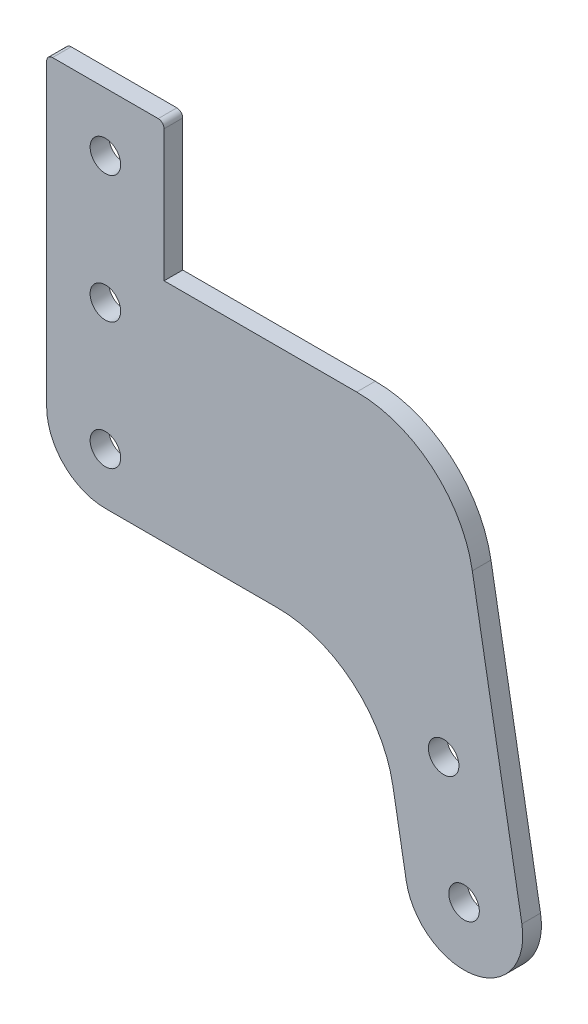
ISO-10303-21;
HEADER;
FILE_DESCRIPTION(('STEP AP214'),'2;1');
FILE_NAME('part.step','',(''),(''),'','','');
FILE_SCHEMA(('AUTOMOTIVE_DESIGN { 1 0 10303 214 1 1 1 1 }'));
ENDSEC;
DATA;
#1=APPLICATION_CONTEXT('core data for automotive mechanical design processes');
#2=APPLICATION_PROTOCOL_DEFINITION('international standard','automotive_design',2000,#1);
#3=PRODUCT_CONTEXT('',#1,'mechanical');
#4=PRODUCT('Part','Part','',(#3));
#5=PRODUCT_RELATED_PRODUCT_CATEGORY('part','',(#4));
#6=PRODUCT_DEFINITION_FORMATION('','',#4);
#7=PRODUCT_DEFINITION_CONTEXT('part definition',#1,'design');
#8=PRODUCT_DEFINITION('design','',#6,#7);
#9=PRODUCT_DEFINITION_SHAPE('','',#8);
#10=(LENGTH_UNIT() NAMED_UNIT(*) SI_UNIT(.MILLI.,.METRE.));
#11=(NAMED_UNIT(*) PLANE_ANGLE_UNIT() SI_UNIT($,.RADIAN.));
#12=(NAMED_UNIT(*) SI_UNIT($,.STERADIAN.) SOLID_ANGLE_UNIT());
#13=UNCERTAINTY_MEASURE_WITH_UNIT(LENGTH_MEASURE(1.E-05),#10,'distance_accuracy_value','');
#14=(GEOMETRIC_REPRESENTATION_CONTEXT(3) GLOBAL_UNCERTAINTY_ASSIGNED_CONTEXT((#13)) GLOBAL_UNIT_ASSIGNED_CONTEXT((#10,
#11,#12)) REPRESENTATION_CONTEXT('',''));
#15=CARTESIAN_POINT('',(0.,0.,0.));
#16=DIRECTION('',(0.,0.,1.));
#17=DIRECTION('',(1.,0.,0.));
#18=AXIS2_PLACEMENT_3D('',#15,#16,#17);
#19=CARTESIAN_POINT('',(71.083923818797,270.455974019315,420.));
#20=DIRECTION('',(0.,0.,1.));
#21=DIRECTION('',(1.,0.,0.));
#22=AXIS2_PLACEMENT_3D('',#19,#20,#21);
#23=CYLINDRICAL_SURFACE('',#22,9.99999999999986);
#24=CARTESIAN_POINT('',(71.083923818797,270.455974019315,423.175));
#25=DIRECTION('',(0.,0.,1.));
#26=DIRECTION('',(1.,0.,0.));
#27=AXIS2_PLACEMENT_3D('',#24,#25,#26);
#28=CIRCLE('',#27,9.99999999999986);
#29=CARTESIAN_POINT('',(61.236098321009,268.71806350231,423.175));
#30=VERTEX_POINT('',#29);
#31=CARTESIAN_POINT('',(72.8208818309538,260.607980474232,423.175));
#32=VERTEX_POINT('',#31);
#33=EDGE_CURVE('E173',#30,#32,#28,.T.);
#34=ORIENTED_EDGE('',*,*,#33,.F.);
#35=DIRECTION('',(0.,0.,1.));
#36=VECTOR('',#35,1.);
#37=CARTESIAN_POINT('',(61.236098321009,268.71806350231,420.));
#38=LINE('',#37,#36);
#39=CARTESIAN_POINT('',(61.236098321009,268.71806350231,420.));
#40=VERTEX_POINT('',#39);
#41=EDGE_CURVE('E11',#40,#30,#38,.T.);
#42=ORIENTED_EDGE('',*,*,#41,.F.);
#43=CARTESIAN_POINT('',(71.083923818797,270.455974019315,420.));
#44=DIRECTION('',(0.,0.,1.));
#45=DIRECTION('',(1.,0.,0.));
#46=AXIS2_PLACEMENT_3D('',#43,#44,#45);
#47=CIRCLE('',#46,9.99999999999986);
#48=CARTESIAN_POINT('',(72.8208818309538,260.607980474232,420.));
#49=VERTEX_POINT('',#48);
#50=EDGE_CURVE('E220',#40,#49,#47,.T.);
#51=ORIENTED_EDGE('',*,*,#50,.T.);
#52=DIRECTION('',(0.,0.,1.));
#53=VECTOR('',#52,1.);
#54=CARTESIAN_POINT('',(72.8208818309538,260.607980474232,420.));
#55=LINE('',#54,#53);
#56=EDGE_CURVE('E37',#49,#32,#55,.T.);
#57=ORIENTED_EDGE('',*,*,#56,.T.);
#58=EDGE_LOOP('',(#34,#42,#51,#57));
#59=FACE_BOUND('',#58,.T.);
#60=ADVANCED_FACE('F34',(#59),#23,.T.);
#61=CARTESIAN_POINT('',(58.9846529645977,281.47582103401,420.));
#62=DIRECTION('',(-0.984782549778797,-0.173791051700518,0.));
#63=DIRECTION('',(0.173791051700518,-0.984782549778797,0.));
#64=AXIS2_PLACEMENT_3D('',#61,#62,#63);
#65=PLANE('',#64);
#66=DIRECTION('',(0.173791051700518,-0.984782549778797,0.));
#67=VECTOR('',#66,1.);
#68=CARTESIAN_POINT('',(58.9846529645977,281.47582103401,423.175));
#69=LINE('',#68,#67);
#70=CARTESIAN_POINT('',(58.9846529645977,281.47582103401,423.175));
#71=VERTEX_POINT('',#70);
#72=EDGE_CURVE('E218',#71,#30,#69,.T.);
#73=ORIENTED_EDGE('',*,*,#72,.F.);
#74=DIRECTION('',(0.,0.,1.));
#75=VECTOR('',#74,1.);
#76=CARTESIAN_POINT('',(58.9846529645977,281.47582103401,420.));
#77=LINE('',#76,#75);
#78=CARTESIAN_POINT('',(58.9846529645977,281.47582103401,420.));
#79=VERTEX_POINT('',#78);
#80=EDGE_CURVE('E43',#79,#71,#77,.T.);
#81=ORIENTED_EDGE('',*,*,#80,.F.);
#82=DIRECTION('',(0.173791051700518,-0.984782549778797,0.));
#83=VECTOR('',#82,1.);
#84=CARTESIAN_POINT('',(58.9846529645977,281.47582103401,420.));
#85=LINE('',#84,#83);
#86=EDGE_CURVE('E163',#79,#40,#85,.T.);
#87=ORIENTED_EDGE('',*,*,#86,.T.);
#88=ORIENTED_EDGE('',*,*,#41,.T.);
#89=EDGE_LOOP('',(#73,#81,#87,#88));
#90=FACE_BOUND('',#89,.T.);
#91=ADVANCED_FACE('F246',(#90),#65,.T.);
#92=CARTESIAN_POINT('',(39.2890019690218,278.,420.));
#93=DIRECTION('',(0.,0.,1.));
#94=DIRECTION('',(1.,0.,0.));
#95=AXIS2_PLACEMENT_3D('',#92,#93,#94);
#96=CYLINDRICAL_SURFACE('',#95,20.);
#97=CARTESIAN_POINT('',(39.2890019690218,278.,423.175));
#98=DIRECTION('',(0.,0.,-1.));
#99=DIRECTION('',(-1.,0.,0.));
#100=AXIS2_PLACEMENT_3D('',#97,#98,#99);
#101=CIRCLE('',#100,20.);
#102=CARTESIAN_POINT('',(39.2890019690218,298.,423.175));
#103=VERTEX_POINT('',#102);
#104=EDGE_CURVE('E150',#103,#71,#101,.T.);
#105=ORIENTED_EDGE('',*,*,#104,.F.);
#106=DIRECTION('',(0.,0.,1.));
#107=VECTOR('',#106,1.);
#108=CARTESIAN_POINT('',(39.2890019690218,298.,420.));
#109=LINE('',#108,#107);
#110=CARTESIAN_POINT('',(39.2890019690218,298.,420.));
#111=VERTEX_POINT('',#110);
#112=EDGE_CURVE('E145',#111,#103,#109,.T.);
#113=ORIENTED_EDGE('',*,*,#112,.F.);
#114=CARTESIAN_POINT('',(39.2890019690218,278.,420.));
#115=DIRECTION('',(0.,0.,-1.));
#116=DIRECTION('',(-1.,0.,0.));
#117=AXIS2_PLACEMENT_3D('',#114,#115,#116);
#118=CIRCLE('',#117,20.);
#119=EDGE_CURVE('E148',#111,#79,#118,.T.);
#120=ORIENTED_EDGE('',*,*,#119,.T.);
#121=ORIENTED_EDGE('',*,*,#80,.T.);
#122=EDGE_LOOP('',(#105,#113,#120,#121));
#123=FACE_BOUND('',#122,.T.);
#124=ADVANCED_FACE('F147',(#123),#96,.F.);
#125=CARTESIAN_POINT('',(10.,298.,420.));
#126=DIRECTION('',(0.,-1.,0.));
#127=DIRECTION('',(1.,0.,0.));
#128=AXIS2_PLACEMENT_3D('',#125,#126,#127);
#129=PLANE('',#128);
#130=DIRECTION('',(1.,0.,0.));
#131=VECTOR('',#130,1.);
#132=CARTESIAN_POINT('',(10.,298.,423.175));
#133=LINE('',#132,#131);
#134=CARTESIAN_POINT('',(10.,298.,423.175));
#135=VERTEX_POINT('',#134);
#136=EDGE_CURVE('E215',#135,#103,#133,.T.);
#137=ORIENTED_EDGE('',*,*,#136,.F.);
#138=DIRECTION('',(0.,0.,1.));
#139=VECTOR('',#138,1.);
#140=CARTESIAN_POINT('',(10.,298.,420.));
#141=LINE('',#140,#139);
#142=CARTESIAN_POINT('',(10.,298.,420.));
#143=VERTEX_POINT('',#142);
#144=EDGE_CURVE('E155',#143,#135,#141,.T.);
#145=ORIENTED_EDGE('',*,*,#144,.F.);
#146=DIRECTION('',(1.,0.,0.));
#147=VECTOR('',#146,1.);
#148=CARTESIAN_POINT('',(10.,298.,420.));
#149=LINE('',#148,#147);
#150=EDGE_CURVE('E161',#143,#111,#149,.T.);
#151=ORIENTED_EDGE('',*,*,#150,.T.);
#152=ORIENTED_EDGE('',*,*,#112,.T.);
#153=EDGE_LOOP('',(#137,#145,#151,#152));
#154=FACE_BOUND('',#153,.T.);
#155=ADVANCED_FACE('F165',(#154),#129,.T.);
#156=CARTESIAN_POINT('',(10.,308.,420.));
#157=DIRECTION('',(0.,0.,1.));
#158=DIRECTION('',(1.,0.,0.));
#159=AXIS2_PLACEMENT_3D('',#156,#157,#158);
#160=CYLINDRICAL_SURFACE('',#159,10.);
#161=CARTESIAN_POINT('',(10.,308.,423.175));
#162=DIRECTION('',(0.,0.,1.));
#163=DIRECTION('',(1.,0.,0.));
#164=AXIS2_PLACEMENT_3D('',#161,#162,#163);
#165=CIRCLE('',#164,10.);
#166=CARTESIAN_POINT('',(0.,308.,423.175));
#167=VERTEX_POINT('',#166);
#168=EDGE_CURVE('E212',#167,#135,#165,.T.);
#169=ORIENTED_EDGE('',*,*,#168,.F.);
#170=DIRECTION('',(0.,0.,1.));
#171=VECTOR('',#170,1.);
#172=CARTESIAN_POINT('',(0.,308.,420.));
#173=LINE('',#172,#171);
#174=CARTESIAN_POINT('',(0.,308.,420.));
#175=VERTEX_POINT('',#174);
#176=EDGE_CURVE('E224',#175,#167,#173,.T.);
#177=ORIENTED_EDGE('',*,*,#176,.F.);
#178=CARTESIAN_POINT('',(10.,308.,420.));
#179=DIRECTION('',(0.,0.,1.));
#180=DIRECTION('',(1.,0.,0.));
#181=AXIS2_PLACEMENT_3D('',#178,#179,#180);
#182=CIRCLE('',#181,10.);
#183=EDGE_CURVE('E166',#175,#143,#182,.T.);
#184=ORIENTED_EDGE('',*,*,#183,.T.);
#185=ORIENTED_EDGE('',*,*,#144,.T.);
#186=EDGE_LOOP('',(#169,#177,#184,#185));
#187=FACE_BOUND('',#186,.T.);
#188=ADVANCED_FACE('F259',(#187),#160,.T.);
#189=CARTESIAN_POINT('',(0.,359.,420.));
#190=DIRECTION('',(-1.,0.,0.));
#191=DIRECTION('',(0.,0.,1.));
#192=AXIS2_PLACEMENT_3D('',#189,#190,#191);
#193=PLANE('',#192);
#194=DIRECTION('',(0.,-1.,0.));
#195=VECTOR('',#194,1.);
#196=CARTESIAN_POINT('',(0.,359.,423.175));
#197=LINE('',#196,#195);
#198=CARTESIAN_POINT('',(0.,359.,423.175));
#199=VERTEX_POINT('',#198);
#200=EDGE_CURVE('E209',#199,#167,#197,.T.);
#201=ORIENTED_EDGE('',*,*,#200,.F.);
#202=DIRECTION('',(0.,0.,1.));
#203=VECTOR('',#202,1.);
#204=CARTESIAN_POINT('',(0.,359.,420.));
#205=LINE('',#204,#203);
#206=CARTESIAN_POINT('',(0.,359.,420.));
#207=VERTEX_POINT('',#206);
#208=EDGE_CURVE('E226',#207,#199,#205,.T.);
#209=ORIENTED_EDGE('',*,*,#208,.F.);
#210=DIRECTION('',(0.,-1.,0.));
#211=VECTOR('',#210,1.);
#212=CARTESIAN_POINT('',(0.,359.,420.));
#213=LINE('',#212,#211);
#214=EDGE_CURVE('E168',#207,#175,#213,.T.);
#215=ORIENTED_EDGE('',*,*,#214,.T.);
#216=ORIENTED_EDGE('',*,*,#176,.T.);
#217=EDGE_LOOP('',(#201,#209,#215,#216));
#218=FACE_BOUND('',#217,.T.);
#219=ADVANCED_FACE('F262',(#218),#193,.T.);
#220=CARTESIAN_POINT('',(1.,359.,420.));
#221=DIRECTION('',(0.,0.,1.));
#222=DIRECTION('',(1.,0.,0.));
#223=AXIS2_PLACEMENT_3D('',#220,#221,#222);
#224=CYLINDRICAL_SURFACE('',#223,1.);
#225=CARTESIAN_POINT('',(1.,359.,423.175));
#226=DIRECTION('',(0.,0.,1.));
#227=DIRECTION('',(1.,0.,0.));
#228=AXIS2_PLACEMENT_3D('',#225,#226,#227);
#229=CIRCLE('',#228,1.);
#230=CARTESIAN_POINT('',(1.,360.,423.175));
#231=VERTEX_POINT('',#230);
#232=EDGE_CURVE('E206',#231,#199,#229,.T.);
#233=ORIENTED_EDGE('',*,*,#232,.F.);
#234=DIRECTION('',(0.,0.,1.));
#235=VECTOR('',#234,1.);
#236=CARTESIAN_POINT('',(1.,360.,420.));
#237=LINE('',#236,#235);
#238=CARTESIAN_POINT('',(1.,360.,420.));
#239=VERTEX_POINT('',#238);
#240=EDGE_CURVE('E228',#239,#231,#237,.T.);
#241=ORIENTED_EDGE('',*,*,#240,.F.);
#242=CARTESIAN_POINT('',(1.,359.,420.));
#243=DIRECTION('',(0.,0.,1.));
#244=DIRECTION('',(1.,0.,0.));
#245=AXIS2_PLACEMENT_3D('',#242,#243,#244);
#246=CIRCLE('',#245,1.);
#247=EDGE_CURVE('E392',#239,#207,#246,.T.);
#248=ORIENTED_EDGE('',*,*,#247,.T.);
#249=ORIENTED_EDGE('',*,*,#208,.T.);
#250=EDGE_LOOP('',(#233,#241,#248,#249));
#251=FACE_BOUND('',#250,.T.);
#252=ADVANCED_FACE('F266',(#251),#224,.T.);
#253=CARTESIAN_POINT('',(19.,360.,420.));
#254=DIRECTION('',(0.,1.,0.));
#255=DIRECTION('',(0.,0.,1.));
#256=AXIS2_PLACEMENT_3D('',#253,#254,#255);
#257=PLANE('',#256);
#258=DIRECTION('',(-1.,0.,0.));
#259=VECTOR('',#258,1.);
#260=CARTESIAN_POINT('',(19.,360.,423.175));
#261=LINE('',#260,#259);
#262=CARTESIAN_POINT('',(19.,360.,423.175));
#263=VERTEX_POINT('',#262);
#264=EDGE_CURVE('E203',#263,#231,#261,.T.);
#265=ORIENTED_EDGE('',*,*,#264,.F.);
#266=DIRECTION('',(0.,0.,1.));
#267=VECTOR('',#266,1.);
#268=CARTESIAN_POINT('',(19.,360.,420.));
#269=LINE('',#268,#267);
#270=CARTESIAN_POINT('',(19.,360.,420.));
#271=VERTEX_POINT('',#270);
#272=EDGE_CURVE('E230',#271,#263,#269,.T.);
#273=ORIENTED_EDGE('',*,*,#272,.F.);
#274=DIRECTION('',(-1.,0.,0.));
#275=VECTOR('',#274,1.);
#276=CARTESIAN_POINT('',(19.,360.,420.));
#277=LINE('',#276,#275);
#278=EDGE_CURVE('E389',#271,#239,#277,.T.);
#279=ORIENTED_EDGE('',*,*,#278,.T.);
#280=ORIENTED_EDGE('',*,*,#240,.T.);
#281=EDGE_LOOP('',(#265,#273,#279,#280));
#282=FACE_BOUND('',#281,.T.);
#283=ADVANCED_FACE('F270',(#282),#257,.T.);
#284=CARTESIAN_POINT('',(19.,359.,420.));
#285=DIRECTION('',(0.,0.,1.));
#286=DIRECTION('',(1.,0.,0.));
#287=AXIS2_PLACEMENT_3D('',#284,#285,#286);
#288=CYLINDRICAL_SURFACE('',#287,0.999999999999999);
#289=CARTESIAN_POINT('',(19.,359.,423.175));
#290=DIRECTION('',(0.,0.,1.));
#291=DIRECTION('',(1.,0.,0.));
#292=AXIS2_PLACEMENT_3D('',#289,#290,#291);
#293=CIRCLE('',#292,0.999999999999999);
#294=CARTESIAN_POINT('',(20.,359.,423.175));
#295=VERTEX_POINT('',#294);
#296=EDGE_CURVE('E200',#295,#263,#293,.T.);
#297=ORIENTED_EDGE('',*,*,#296,.F.);
#298=DIRECTION('',(0.,0.,1.));
#299=VECTOR('',#298,1.);
#300=CARTESIAN_POINT('',(20.,359.,420.));
#301=LINE('',#300,#299);
#302=CARTESIAN_POINT('',(20.,359.,420.));
#303=VERTEX_POINT('',#302);
#304=EDGE_CURVE('E232',#303,#295,#301,.T.);
#305=ORIENTED_EDGE('',*,*,#304,.F.);
#306=CARTESIAN_POINT('',(19.,359.,420.));
#307=DIRECTION('',(0.,0.,1.));
#308=DIRECTION('',(1.,0.,0.));
#309=AXIS2_PLACEMENT_3D('',#306,#307,#308);
#310=CIRCLE('',#309,0.999999999999999);
#311=EDGE_CURVE('E386',#303,#271,#310,.T.);
#312=ORIENTED_EDGE('',*,*,#311,.T.);
#313=ORIENTED_EDGE('',*,*,#272,.T.);
#314=EDGE_LOOP('',(#297,#305,#312,#313));
#315=FACE_BOUND('',#314,.T.);
#316=ADVANCED_FACE('F274',(#315),#288,.T.);
#317=CARTESIAN_POINT('',(20.,336.575000000001,420.));
#318=DIRECTION('',(1.,0.,0.));
#319=DIRECTION('',(0.,1.,0.));
#320=AXIS2_PLACEMENT_3D('',#317,#318,#319);
#321=PLANE('',#320);
#322=DIRECTION('',(0.,1.,0.));
#323=VECTOR('',#322,1.);
#324=CARTESIAN_POINT('',(20.,336.575000000001,423.175));
#325=LINE('',#324,#323);
#326=CARTESIAN_POINT('',(20.,336.575000000001,423.175));
#327=VERTEX_POINT('',#326);
#328=EDGE_CURVE('E197',#327,#295,#325,.T.);
#329=ORIENTED_EDGE('',*,*,#328,.F.);
#330=DIRECTION('',(0.,0.,1.));
#331=VECTOR('',#330,1.);
#332=CARTESIAN_POINT('',(20.,336.575000000001,420.));
#333=LINE('',#332,#331);
#334=CARTESIAN_POINT('',(20.,336.575000000001,420.));
#335=VERTEX_POINT('',#334);
#336=EDGE_CURVE('E234',#335,#327,#333,.T.);
#337=ORIENTED_EDGE('',*,*,#336,.F.);
#338=DIRECTION('',(0.,1.,0.));
#339=VECTOR('',#338,1.);
#340=CARTESIAN_POINT('',(20.,336.575000000001,420.));
#341=LINE('',#340,#339);
#342=EDGE_CURVE('E383',#335,#303,#341,.T.);
#343=ORIENTED_EDGE('',*,*,#342,.T.);
#344=ORIENTED_EDGE('',*,*,#304,.T.);
#345=EDGE_LOOP('',(#329,#337,#343,#344));
#346=FACE_BOUND('',#345,.T.);
#347=ADVANCED_FACE('F278',(#346),#321,.T.);
#348=CARTESIAN_POINT('',(52.7962249915629,336.575000000001,420.));
#349=DIRECTION('',(0.,1.,0.));
#350=DIRECTION('',(0.,0.,1.));
#351=AXIS2_PLACEMENT_3D('',#348,#349,#350);
#352=PLANE('',#351);
#353=DIRECTION('',(-1.,0.,0.));
#354=VECTOR('',#353,1.);
#355=CARTESIAN_POINT('',(52.7962249915629,336.575000000001,423.175));
#356=LINE('',#355,#354);
#357=CARTESIAN_POINT('',(52.7962249915629,336.575000000001,423.175));
#358=VERTEX_POINT('',#357);
#359=EDGE_CURVE('E194',#358,#327,#356,.T.);
#360=ORIENTED_EDGE('',*,*,#359,.F.);
#361=DIRECTION('',(0.,0.,1.));
#362=VECTOR('',#361,1.);
#363=CARTESIAN_POINT('',(52.7962249915629,336.575000000001,420.));
#364=LINE('',#363,#362);
#365=CARTESIAN_POINT('',(52.7962249915629,336.575000000001,420.));
#366=VERTEX_POINT('',#365);
#367=EDGE_CURVE('E236',#366,#358,#364,.T.);
#368=ORIENTED_EDGE('',*,*,#367,.F.);
#369=DIRECTION('',(-1.,0.,0.));
#370=VECTOR('',#369,1.);
#371=CARTESIAN_POINT('',(52.7962249915629,336.575000000001,420.));
#372=LINE('',#371,#370);
#373=EDGE_CURVE('E380',#366,#335,#372,.T.);
#374=ORIENTED_EDGE('',*,*,#373,.T.);
#375=ORIENTED_EDGE('',*,*,#336,.T.);
#376=EDGE_LOOP('',(#360,#368,#374,#375));
#377=FACE_BOUND('',#376,.T.);
#378=ADVANCED_FACE('F282',(#377),#352,.T.);
#379=CARTESIAN_POINT('',(52.7962249915629,316.575000000001,420.));
#380=DIRECTION('',(0.,0.,1.));
#381=DIRECTION('',(1.,0.,0.));
#382=AXIS2_PLACEMENT_3D('',#379,#380,#381);
#383=CYLINDRICAL_SURFACE('',#382,20.);
#384=CARTESIAN_POINT('',(52.7962249915629,316.575000000001,423.175));
#385=DIRECTION('',(0.,0.,1.));
#386=DIRECTION('',(1.,0.,0.));
#387=AXIS2_PLACEMENT_3D('',#384,#385,#386);
#388=CIRCLE('',#387,20.);
#389=CARTESIAN_POINT('',(72.4922120817297,320.048916024315,423.175));
#390=VERTEX_POINT('',#389);
#391=EDGE_CURVE('E191',#390,#358,#388,.T.);
#392=ORIENTED_EDGE('',*,*,#391,.F.);
#393=DIRECTION('',(0.,0.,1.));
#394=VECTOR('',#393,1.);
#395=CARTESIAN_POINT('',(72.4922120817297,320.048916024315,420.));
#396=LINE('',#395,#394);
#397=CARTESIAN_POINT('',(72.4922120817297,320.048916024315,420.));
#398=VERTEX_POINT('',#397);
#399=EDGE_CURVE('E238',#398,#390,#396,.T.);
#400=ORIENTED_EDGE('',*,*,#399,.F.);
#401=CARTESIAN_POINT('',(52.7962249915629,316.575000000001,420.));
#402=DIRECTION('',(0.,0.,1.));
#403=DIRECTION('',(1.,0.,0.));
#404=AXIS2_PLACEMENT_3D('',#401,#402,#403);
#405=CIRCLE('',#404,20.);
#406=EDGE_CURVE('E377',#398,#366,#405,.T.);
#407=ORIENTED_EDGE('',*,*,#406,.T.);
#408=ORIENTED_EDGE('',*,*,#367,.T.);
#409=EDGE_LOOP('',(#392,#400,#407,#408));
#410=FACE_BOUND('',#409,.T.);
#411=ADVANCED_FACE('F286',(#410),#383,.T.);
#412=CARTESIAN_POINT('',(80.9328698307937,272.19310002458,420.));
#413=DIRECTION('',(0.98479935450834,0.173695801215679,0.));
#414=DIRECTION('',(-0.173695801215679,0.98479935450834,0.));
#415=AXIS2_PLACEMENT_3D('',#412,#413,#414);
#416=PLANE('',#415);
#417=DIRECTION('',(-0.173695801215679,0.98479935450834,0.));
#418=VECTOR('',#417,1.);
#419=CARTESIAN_POINT('',(80.9328698307937,272.19310002458,423.175));
#420=LINE('',#419,#418);
#421=CARTESIAN_POINT('',(80.9328698307937,272.19310002458,423.175));
#422=VERTEX_POINT('',#421);
#423=EDGE_CURVE('E188',#422,#390,#420,.T.);
#424=ORIENTED_EDGE('',*,*,#423,.F.);
#425=DIRECTION('',(0.,0.,1.));
#426=VECTOR('',#425,1.);
#427=CARTESIAN_POINT('',(80.9328698307937,272.19310002458,420.));
#428=LINE('',#427,#426);
#429=CARTESIAN_POINT('',(80.9328698307937,272.19310002458,420.));
#430=VERTEX_POINT('',#429);
#431=EDGE_CURVE('E240',#430,#422,#428,.T.);
#432=ORIENTED_EDGE('',*,*,#431,.F.);
#433=DIRECTION('',(-0.173695801215679,0.98479935450834,0.));
#434=VECTOR('',#433,1.);
#435=CARTESIAN_POINT('',(80.9328698307937,272.19310002458,420.));
#436=LINE('',#435,#434);
#437=EDGE_CURVE('E374',#430,#398,#436,.T.);
#438=ORIENTED_EDGE('',*,*,#437,.T.);
#439=ORIENTED_EDGE('',*,*,#399,.T.);
#440=EDGE_LOOP('',(#424,#432,#438,#439));
#441=FACE_BOUND('',#440,.T.);
#442=ADVANCED_FACE('F290',(#441),#416,.T.);
#443=CARTESIAN_POINT('',(71.0848762857103,270.456142012423,420.));
#444=DIRECTION('',(0.,0.,1.));
#445=DIRECTION('',(1.,0.,0.));
#446=AXIS2_PLACEMENT_3D('',#443,#444,#445);
#447=CYLINDRICAL_SURFACE('',#446,10.0000000000003);
#448=CARTESIAN_POINT('',(71.0848762857103,270.456142012423,423.175));
#449=DIRECTION('',(0.,0.,1.));
#450=DIRECTION('',(1.,0.,0.));
#451=AXIS2_PLACEMENT_3D('',#448,#449,#450);
#452=CIRCLE('',#451,10.0000000000003);
#453=CARTESIAN_POINT('',(72.8218342978671,260.608148467339,423.175));
#454=VERTEX_POINT('',#453);
#455=EDGE_CURVE('E182',#454,#422,#452,.T.);
#456=ORIENTED_EDGE('',*,*,#455,.F.);
#457=DIRECTION('',(0.,0.,1.));
#458=VECTOR('',#457,1.);
#459=CARTESIAN_POINT('',(72.8218342978671,260.608148467339,420.));
#460=LINE('',#459,#458);
#461=CARTESIAN_POINT('',(72.8218342978671,260.608148467339,420.));
#462=VERTEX_POINT('',#461);
#463=EDGE_CURVE('E241',#462,#454,#460,.T.);
#464=ORIENTED_EDGE('',*,*,#463,.F.);
#465=CARTESIAN_POINT('',(71.0848762857103,270.456142012423,420.));
#466=DIRECTION('',(0.,0.,1.));
#467=DIRECTION('',(1.,0.,0.));
#468=AXIS2_PLACEMENT_3D('',#465,#466,#467);
#469=CIRCLE('',#468,10.0000000000003);
#470=EDGE_CURVE('E368',#462,#430,#469,.T.);
#471=ORIENTED_EDGE('',*,*,#470,.T.);
#472=ORIENTED_EDGE('',*,*,#431,.T.);
#473=EDGE_LOOP('',(#456,#464,#471,#472));
#474=FACE_BOUND('',#473,.T.);
#475=ADVANCED_FACE('F294',(#474),#447,.T.);
#476=CARTESIAN_POINT('',(72.8208818309538,260.607980474232,420.));
#477=DIRECTION('',(0.173695801461096,-0.984799354465054,0.));
#478=DIRECTION('',(0.984799354465054,0.173695801461096,0.));
#479=AXIS2_PLACEMENT_3D('',#476,#477,#478);
#480=PLANE('',#479);
#481=CARTESIAN_POINT('',(72.8208818309538,260.607980474232,423.175));
#482=CARTESIAN_POINT('',(72.8211993199249,260.608036471934,423.175));
#483=CARTESIAN_POINT('',(72.821516808896,260.608092469637,423.175));
#484=CARTESIAN_POINT('',(72.8218342978671,260.608148467339,423.175));
#485=B_SPLINE_CURVE_WITH_KNOTS('',3,(#481,#482,#483,#484),.UNSPECIFIED.,.F.,.F.,(4,4),(0.,1.),.UNSPECIFIED.);
#486=EDGE_CURVE('E176',#32,#454,#485,.T.);
#487=ORIENTED_EDGE('',*,*,#486,.F.);
#488=ORIENTED_EDGE('',*,*,#56,.F.);
#489=CARTESIAN_POINT('',(72.8208818309538,260.607980474232,420.));
#490=CARTESIAN_POINT('',(72.8211993199249,260.608036471934,420.));
#491=CARTESIAN_POINT('',(72.821516808896,260.608092469637,420.));
#492=CARTESIAN_POINT('',(72.8218342978671,260.608148467339,420.));
#493=B_SPLINE_CURVE_WITH_KNOTS('',3,(#489,#490,#491,#492),.UNSPECIFIED.,.F.,.F.,(4,4),(0.,1.),.UNSPECIFIED.);
#494=EDGE_CURVE('E364',#49,#462,#493,.T.);
#495=ORIENTED_EDGE('',*,*,#494,.T.);
#496=ORIENTED_EDGE('',*,*,#463,.T.);
#497=EDGE_LOOP('',(#487,#488,#495,#496));
#498=FACE_BOUND('',#497,.T.);
#499=ADVANCED_FACE('F243',(#498),#480,.T.);
#500=CARTESIAN_POINT('',(71.083923818797,270.455974019315,420.));
#501=DIRECTION('',(0.,0.,1.));
#502=DIRECTION('',(1.,0.,0.));
#503=AXIS2_PLACEMENT_3D('',#500,#501,#502);
#504=PLANE('',#503);
#505=CARTESIAN_POINT('',(67.6109602654587,290.15212907956,420.));
#506=DIRECTION('',(0.,0.,1.));
#507=DIRECTION('',(1.,0.,0.));
#508=AXIS2_PLACEMENT_3D('',#505,#506,#507);
#509=CIRCLE('',#508,2.6);
#510=CARTESIAN_POINT('',(70.2109602654587,290.15212907956,420.));
#511=VERTEX_POINT('',#510);
#512=EDGE_CURVE('E333',#511,#511,#509,.T.);
#513=ORIENTED_EDGE('',*,*,#512,.T.);
#514=EDGE_LOOP('',(#513));
#515=FACE_BOUND('',#514,.T.);
#516=CARTESIAN_POINT('',(10.,349.999999800022,420.));
#517=DIRECTION('',(0.,0.,1.));
#518=DIRECTION('',(1.,0.,0.));
#519=AXIS2_PLACEMENT_3D('',#516,#517,#518);
#520=CIRCLE('',#519,2.60000000000001);
#521=CARTESIAN_POINT('',(12.6,349.999999800022,420.));
#522=VERTEX_POINT('',#521);
#523=EDGE_CURVE('E343',#522,#522,#520,.T.);
#524=ORIENTED_EDGE('',*,*,#523,.T.);
#525=EDGE_LOOP('',(#524));
#526=FACE_BOUND('',#525,.T.);
#527=CARTESIAN_POINT('',(10.,328.378409300022,420.));
#528=DIRECTION('',(0.,0.,1.));
#529=DIRECTION('',(1.,0.,0.));
#530=AXIS2_PLACEMENT_3D('',#527,#528,#529);
#531=CIRCLE('',#530,2.60000000000001);
#532=CARTESIAN_POINT('',(12.6,328.378409300022,420.));
#533=VERTEX_POINT('',#532);
#534=EDGE_CURVE('E349',#533,#533,#531,.T.);
#535=ORIENTED_EDGE('',*,*,#534,.T.);
#536=EDGE_LOOP('',(#535));
#537=FACE_BOUND('',#536,.T.);
#538=CARTESIAN_POINT('',(10.,306.756818800022,420.));
#539=DIRECTION('',(0.,0.,1.));
#540=DIRECTION('',(1.,0.,0.));
#541=AXIS2_PLACEMENT_3D('',#538,#539,#540);
#542=CIRCLE('',#541,2.60000000000001);
#543=CARTESIAN_POINT('',(12.6,306.756818800022,420.));
#544=VERTEX_POINT('',#543);
#545=EDGE_CURVE('E355',#544,#544,#542,.T.);
#546=ORIENTED_EDGE('',*,*,#545,.T.);
#547=EDGE_LOOP('',(#546));
#548=FACE_BOUND('',#547,.T.);
#549=CARTESIAN_POINT('',(71.0839238187971,270.455974019315,420.));
#550=DIRECTION('',(0.,0.,1.));
#551=DIRECTION('',(1.,0.,0.));
#552=AXIS2_PLACEMENT_3D('',#549,#550,#551);
#553=CIRCLE('',#552,2.6);
#554=CARTESIAN_POINT('',(73.6839238187971,270.455974019315,420.));
#555=VERTEX_POINT('',#554);
#556=EDGE_CURVE('E177',#555,#555,#553,.T.);
#557=ORIENTED_EDGE('',*,*,#556,.T.);
#558=EDGE_LOOP('',(#557));
#559=FACE_BOUND('',#558,.T.);
#560=ORIENTED_EDGE('',*,*,#50,.F.);
#561=ORIENTED_EDGE('',*,*,#86,.F.);
#562=ORIENTED_EDGE('',*,*,#119,.F.);
#563=ORIENTED_EDGE('',*,*,#150,.F.);
#564=ORIENTED_EDGE('',*,*,#183,.F.);
#565=ORIENTED_EDGE('',*,*,#214,.F.);
#566=ORIENTED_EDGE('',*,*,#247,.F.);
#567=ORIENTED_EDGE('',*,*,#278,.F.);
#568=ORIENTED_EDGE('',*,*,#311,.F.);
#569=ORIENTED_EDGE('',*,*,#342,.F.);
#570=ORIENTED_EDGE('',*,*,#373,.F.);
#571=ORIENTED_EDGE('',*,*,#406,.F.);
#572=ORIENTED_EDGE('',*,*,#437,.F.);
#573=ORIENTED_EDGE('',*,*,#470,.F.);
#574=ORIENTED_EDGE('',*,*,#494,.F.);
#575=EDGE_LOOP('',(#560,#561,#562,#563,#564,#565,#566,#567,#568,#569,#570,#571,#572,#573,#574));
#576=FACE_BOUND('',#575,.T.);
#577=ADVANCED_FACE('F159',(#515,#526,#537,#548,#559,#576),#504,.F.);
#578=CARTESIAN_POINT('',(71.083923818797,270.455974019315,423.175));
#579=DIRECTION('',(0.,0.,1.));
#580=DIRECTION('',(1.,0.,0.));
#581=AXIS2_PLACEMENT_3D('',#578,#579,#580);
#582=PLANE('',#581);
#583=CARTESIAN_POINT('',(67.6109602654587,290.15212907956,423.175));
#584=DIRECTION('',(0.,0.,1.));
#585=DIRECTION('',(1.,0.,0.));
#586=AXIS2_PLACEMENT_3D('',#583,#584,#585);
#587=CIRCLE('',#586,2.6);
#588=CARTESIAN_POINT('',(70.2109602654587,290.15212907956,423.175));
#589=VERTEX_POINT('',#588);
#590=EDGE_CURVE('E336',#589,#589,#587,.T.);
#591=ORIENTED_EDGE('',*,*,#590,.F.);
#592=EDGE_LOOP('',(#591));
#593=FACE_BOUND('',#592,.T.);
#594=CARTESIAN_POINT('',(10.,349.999999800022,423.175));
#595=DIRECTION('',(0.,0.,1.));
#596=DIRECTION('',(1.,0.,0.));
#597=AXIS2_PLACEMENT_3D('',#594,#595,#596);
#598=CIRCLE('',#597,2.60000000000001);
#599=CARTESIAN_POINT('',(12.6,349.999999800022,423.175));
#600=VERTEX_POINT('',#599);
#601=EDGE_CURVE('E338',#600,#600,#598,.T.);
#602=ORIENTED_EDGE('',*,*,#601,.F.);
#603=EDGE_LOOP('',(#602));
#604=FACE_BOUND('',#603,.T.);
#605=CARTESIAN_POINT('',(10.,328.378409300022,423.175));
#606=DIRECTION('',(0.,0.,1.));
#607=DIRECTION('',(1.,0.,0.));
#608=AXIS2_PLACEMENT_3D('',#605,#606,#607);
#609=CIRCLE('',#608,2.60000000000001);
#610=CARTESIAN_POINT('',(12.6,328.378409300022,423.175));
#611=VERTEX_POINT('',#610);
#612=EDGE_CURVE('E346',#611,#611,#609,.T.);
#613=ORIENTED_EDGE('',*,*,#612,.F.);
#614=EDGE_LOOP('',(#613));
#615=FACE_BOUND('',#614,.T.);
#616=CARTESIAN_POINT('',(10.,306.756818800022,423.175));
#617=DIRECTION('',(0.,0.,1.));
#618=DIRECTION('',(1.,0.,0.));
#619=AXIS2_PLACEMENT_3D('',#616,#617,#618);
#620=CIRCLE('',#619,2.60000000000001);
#621=CARTESIAN_POINT('',(12.6,306.756818800022,423.175));
#622=VERTEX_POINT('',#621);
#623=EDGE_CURVE('E352',#622,#622,#620,.T.);
#624=ORIENTED_EDGE('',*,*,#623,.F.);
#625=EDGE_LOOP('',(#624));
#626=FACE_BOUND('',#625,.T.);
#627=CARTESIAN_POINT('',(71.0839238187971,270.455974019315,423.175));
#628=DIRECTION('',(0.,0.,1.));
#629=DIRECTION('',(1.,0.,0.));
#630=AXIS2_PLACEMENT_3D('',#627,#628,#629);
#631=CIRCLE('',#630,2.6);
#632=CARTESIAN_POINT('',(73.6839238187971,270.455974019315,423.175));
#633=VERTEX_POINT('',#632);
#634=EDGE_CURVE('E358',#633,#633,#631,.T.);
#635=ORIENTED_EDGE('',*,*,#634,.F.);
#636=EDGE_LOOP('',(#635));
#637=FACE_BOUND('',#636,.T.);
#638=ORIENTED_EDGE('',*,*,#33,.T.);
#639=ORIENTED_EDGE('',*,*,#486,.T.);
#640=ORIENTED_EDGE('',*,*,#455,.T.);
#641=ORIENTED_EDGE('',*,*,#423,.T.);
#642=ORIENTED_EDGE('',*,*,#391,.T.);
#643=ORIENTED_EDGE('',*,*,#359,.T.);
#644=ORIENTED_EDGE('',*,*,#328,.T.);
#645=ORIENTED_EDGE('',*,*,#296,.T.);
#646=ORIENTED_EDGE('',*,*,#264,.T.);
#647=ORIENTED_EDGE('',*,*,#232,.T.);
#648=ORIENTED_EDGE('',*,*,#200,.T.);
#649=ORIENTED_EDGE('',*,*,#168,.T.);
#650=ORIENTED_EDGE('',*,*,#136,.T.);
#651=ORIENTED_EDGE('',*,*,#104,.T.);
#652=ORIENTED_EDGE('',*,*,#72,.T.);
#653=EDGE_LOOP('',(#638,#639,#640,#641,#642,#643,#644,#645,#646,#647,#648,#649,#650,#651,#652));
#654=FACE_BOUND('',#653,.T.);
#655=ADVANCED_FACE('F245',(#593,#604,#615,#626,#637,#654),#582,.T.);
#656=CARTESIAN_POINT('',(71.0839238187971,270.455974019315,423.175));
#657=DIRECTION('',(0.,0.,1.));
#658=DIRECTION('',(1.,0.,0.));
#659=AXIS2_PLACEMENT_3D('',#656,#657,#658);
#660=CYLINDRICAL_SURFACE('',#659,2.6);
#661=ORIENTED_EDGE('',*,*,#556,.F.);
#662=EDGE_LOOP('',(#661));
#663=FACE_BOUND('',#662,.T.);
#664=ORIENTED_EDGE('',*,*,#634,.T.);
#665=EDGE_LOOP('',(#664));
#666=FACE_BOUND('',#665,.T.);
#667=ADVANCED_FACE('F306',(#663,#666),#660,.F.);
#668=CARTESIAN_POINT('',(10.,306.756818800022,423.175));
#669=DIRECTION('',(0.,0.,1.));
#670=DIRECTION('',(1.,0.,0.));
#671=AXIS2_PLACEMENT_3D('',#668,#669,#670);
#672=CYLINDRICAL_SURFACE('',#671,2.60000000000001);
#673=ORIENTED_EDGE('',*,*,#545,.F.);
#674=EDGE_LOOP('',(#673));
#675=FACE_BOUND('',#674,.T.);
#676=ORIENTED_EDGE('',*,*,#623,.T.);
#677=EDGE_LOOP('',(#676));
#678=FACE_BOUND('',#677,.T.);
#679=ADVANCED_FACE('F313',(#675,#678),#672,.F.);
#680=CARTESIAN_POINT('',(10.,328.378409300022,423.175));
#681=DIRECTION('',(0.,0.,1.));
#682=DIRECTION('',(1.,0.,0.));
#683=AXIS2_PLACEMENT_3D('',#680,#681,#682);
#684=CYLINDRICAL_SURFACE('',#683,2.60000000000001);
#685=ORIENTED_EDGE('',*,*,#534,.F.);
#686=EDGE_LOOP('',(#685));
#687=FACE_BOUND('',#686,.T.);
#688=ORIENTED_EDGE('',*,*,#612,.T.);
#689=EDGE_LOOP('',(#688));
#690=FACE_BOUND('',#689,.T.);
#691=ADVANCED_FACE('F317',(#687,#690),#684,.F.);
#692=CARTESIAN_POINT('',(10.,349.999999800022,423.175));
#693=DIRECTION('',(0.,0.,1.));
#694=DIRECTION('',(1.,0.,0.));
#695=AXIS2_PLACEMENT_3D('',#692,#693,#694);
#696=CYLINDRICAL_SURFACE('',#695,2.60000000000001);
#697=ORIENTED_EDGE('',*,*,#523,.F.);
#698=EDGE_LOOP('',(#697));
#699=FACE_BOUND('',#698,.T.);
#700=ORIENTED_EDGE('',*,*,#601,.T.);
#701=EDGE_LOOP('',(#700));
#702=FACE_BOUND('',#701,.T.);
#703=ADVANCED_FACE('F321',(#699,#702),#696,.F.);
#704=CARTESIAN_POINT('',(67.6109602654587,290.15212907956,423.175));
#705=DIRECTION('',(0.,0.,1.));
#706=DIRECTION('',(1.,0.,0.));
#707=AXIS2_PLACEMENT_3D('',#704,#705,#706);
#708=CYLINDRICAL_SURFACE('',#707,2.6);
#709=ORIENTED_EDGE('',*,*,#512,.F.);
#710=EDGE_LOOP('',(#709));
#711=FACE_BOUND('',#710,.T.);
#712=ORIENTED_EDGE('',*,*,#590,.T.);
#713=EDGE_LOOP('',(#712));
#714=FACE_BOUND('',#713,.T.);
#715=ADVANCED_FACE('F325',(#711,#714),#708,.F.);
#716=CLOSED_SHELL('',(#60,#91,#124,#155,#188,#219,#252,#283,#316,#347,#378,#411,#442,#475,#499,
#577,#655,#667,#679,#691,#703,#715));
#717=MANIFOLD_SOLID_BREP('B2',#716);
#718=ADVANCED_BREP_SHAPE_REPRESENTATION('',(#18,#717),#14);
#719=SHAPE_DEFINITION_REPRESENTATION(#9,#718);
ENDSEC;
END-ISO-10303-21;
